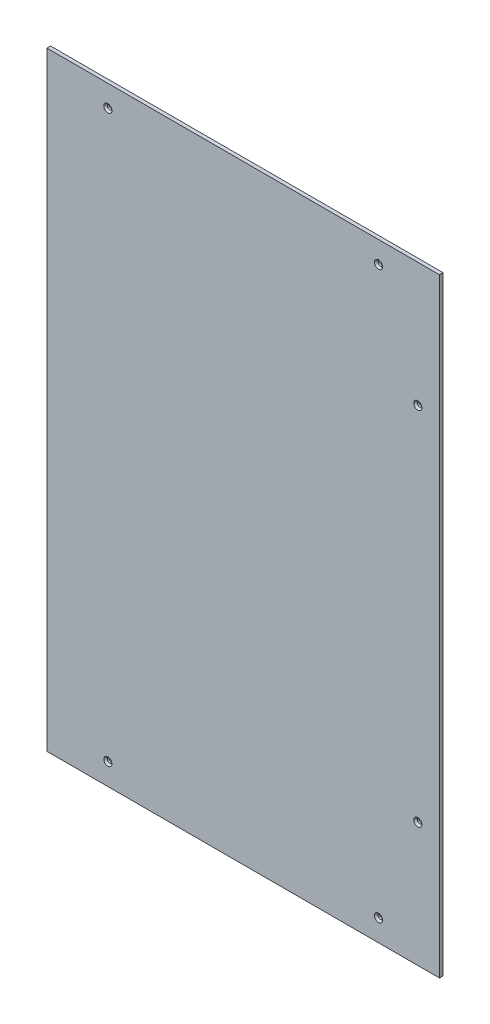
ISO-10303-21;
HEADER;
FILE_DESCRIPTION(('STEP AP214'),'2;1');
FILE_NAME('part.step','',(''),(''),'','','');
FILE_SCHEMA(('AUTOMOTIVE_DESIGN { 1 0 10303 214 1 1 1 1 }'));
ENDSEC;
DATA;
#1=APPLICATION_CONTEXT('core data for automotive mechanical design processes');
#2=APPLICATION_PROTOCOL_DEFINITION('international standard','automotive_design',2000,#1);
#3=PRODUCT_CONTEXT('',#1,'mechanical');
#4=PRODUCT('Part','Part','',(#3));
#5=PRODUCT_RELATED_PRODUCT_CATEGORY('part','',(#4));
#6=PRODUCT_DEFINITION_FORMATION('','',#4);
#7=PRODUCT_DEFINITION_CONTEXT('part definition',#1,'design');
#8=PRODUCT_DEFINITION('design','',#6,#7);
#9=PRODUCT_DEFINITION_SHAPE('','',#8);
#10=(LENGTH_UNIT() NAMED_UNIT(*) SI_UNIT(.MILLI.,.METRE.));
#11=(NAMED_UNIT(*) PLANE_ANGLE_UNIT() SI_UNIT($,.RADIAN.));
#12=(NAMED_UNIT(*) SI_UNIT($,.STERADIAN.) SOLID_ANGLE_UNIT());
#13=UNCERTAINTY_MEASURE_WITH_UNIT(LENGTH_MEASURE(1.E-05),#10,'distance_accuracy_value','');
#14=(GEOMETRIC_REPRESENTATION_CONTEXT(3) GLOBAL_UNCERTAINTY_ASSIGNED_CONTEXT((#13)) GLOBAL_UNIT_ASSIGNED_CONTEXT((#10,
#11,#12)) REPRESENTATION_CONTEXT('',''));
#15=CARTESIAN_POINT('',(0.,0.,0.));
#16=DIRECTION('',(0.,0.,1.));
#17=DIRECTION('',(1.,0.,0.));
#18=AXIS2_PLACEMENT_3D('',#15,#16,#17);
#19=CARTESIAN_POINT('',(217.5,-337.5,2.));
#20=DIRECTION('',(-1.,0.,0.));
#21=DIRECTION('',(0.,0.,1.));
#22=AXIS2_PLACEMENT_3D('',#19,#20,#21);
#23=PLANE('',#22);
#24=DIRECTION('',(0.,1.,0.));
#25=VECTOR('',#24,1.);
#26=CARTESIAN_POINT('',(217.5,-337.5,-2.));
#27=LINE('',#26,#25);
#28=CARTESIAN_POINT('',(217.5,-337.5,-2.));
#29=VERTEX_POINT('',#28);
#30=CARTESIAN_POINT('',(217.5,337.5,-2.));
#31=VERTEX_POINT('',#30);
#32=EDGE_CURVE('E126',#29,#31,#27,.T.);
#33=ORIENTED_EDGE('',*,*,#32,.T.);
#34=DIRECTION('',(0.,0.,-1.));
#35=VECTOR('',#34,1.);
#36=CARTESIAN_POINT('',(217.5,337.5,2.));
#37=LINE('',#36,#35);
#38=CARTESIAN_POINT('',(217.5,337.5,2.));
#39=VERTEX_POINT('',#38);
#40=EDGE_CURVE('E114',#39,#31,#37,.T.);
#41=ORIENTED_EDGE('',*,*,#40,.F.);
#42=DIRECTION('',(0.,1.,0.));
#43=VECTOR('',#42,1.);
#44=CARTESIAN_POINT('',(217.5,-337.5,2.));
#45=LINE('',#44,#43);
#46=CARTESIAN_POINT('',(217.5,-337.5,2.));
#47=VERTEX_POINT('',#46);
#48=EDGE_CURVE('E106',#47,#39,#45,.T.);
#49=ORIENTED_EDGE('',*,*,#48,.F.);
#50=DIRECTION('',(0.,0.,-1.));
#51=VECTOR('',#50,1.);
#52=CARTESIAN_POINT('',(217.5,-337.5,2.));
#53=LINE('',#52,#51);
#54=EDGE_CURVE('E122',#47,#29,#53,.T.);
#55=ORIENTED_EDGE('',*,*,#54,.T.);
#56=EDGE_LOOP('',(#33,#41,#49,#55));
#57=FACE_BOUND('',#56,.T.);
#58=ADVANCED_FACE('F51',(#57),#23,.F.);
#59=CARTESIAN_POINT('',(-217.5,337.5,2.));
#60=DIRECTION('',(0.,-1.,0.));
#61=DIRECTION('',(0.,0.,-1.));
#62=AXIS2_PLACEMENT_3D('',#59,#60,#61);
#63=PLANE('',#62);
#64=DIRECTION('',(-1.,0.,0.));
#65=VECTOR('',#64,1.);
#66=CARTESIAN_POINT('',(-217.5,337.5,-2.));
#67=LINE('',#66,#65);
#68=CARTESIAN_POINT('',(-217.5,337.5,-2.));
#69=VERTEX_POINT('',#68);
#70=EDGE_CURVE('E112',#31,#69,#67,.T.);
#71=ORIENTED_EDGE('',*,*,#70,.T.);
#72=DIRECTION('',(0.,0.,-1.));
#73=VECTOR('',#72,1.);
#74=CARTESIAN_POINT('',(-217.5,337.5,2.));
#75=LINE('',#74,#73);
#76=CARTESIAN_POINT('',(-217.5,337.5,2.));
#77=VERTEX_POINT('',#76);
#78=EDGE_CURVE('E110',#77,#69,#75,.T.);
#79=ORIENTED_EDGE('',*,*,#78,.F.);
#80=DIRECTION('',(-1.,0.,0.));
#81=VECTOR('',#80,1.);
#82=CARTESIAN_POINT('',(-217.5,337.5,2.));
#83=LINE('',#82,#81);
#84=EDGE_CURVE('E101',#39,#77,#83,.T.);
#85=ORIENTED_EDGE('',*,*,#84,.F.);
#86=ORIENTED_EDGE('',*,*,#40,.T.);
#87=EDGE_LOOP('',(#71,#79,#85,#86));
#88=FACE_BOUND('',#87,.T.);
#89=ADVANCED_FACE('F111',(#88),#63,.F.);
#90=CARTESIAN_POINT('',(-217.5,-337.5,2.));
#91=DIRECTION('',(1.,0.,0.));
#92=DIRECTION('',(0.,0.,-1.));
#93=AXIS2_PLACEMENT_3D('',#90,#91,#92);
#94=PLANE('',#93);
#95=DIRECTION('',(0.,-1.,0.));
#96=VECTOR('',#95,1.);
#97=CARTESIAN_POINT('',(-217.5,-337.5,-2.));
#98=LINE('',#97,#96);
#99=CARTESIAN_POINT('',(-217.5,-337.5,-2.));
#100=VERTEX_POINT('',#99);
#101=EDGE_CURVE('E87',#69,#100,#98,.T.);
#102=ORIENTED_EDGE('',*,*,#101,.T.);
#103=DIRECTION('',(0.,0.,-1.));
#104=VECTOR('',#103,1.);
#105=CARTESIAN_POINT('',(-217.5,-337.5,2.));
#106=LINE('',#105,#104);
#107=CARTESIAN_POINT('',(-217.5,-337.5,2.));
#108=VERTEX_POINT('',#107);
#109=EDGE_CURVE('E115',#108,#100,#106,.T.);
#110=ORIENTED_EDGE('',*,*,#109,.F.);
#111=DIRECTION('',(0.,-1.,0.));
#112=VECTOR('',#111,1.);
#113=CARTESIAN_POINT('',(-217.5,-337.5,2.));
#114=LINE('',#113,#112);
#115=EDGE_CURVE('E104',#77,#108,#114,.T.);
#116=ORIENTED_EDGE('',*,*,#115,.F.);
#117=ORIENTED_EDGE('',*,*,#78,.T.);
#118=EDGE_LOOP('',(#102,#110,#116,#117));
#119=FACE_BOUND('',#118,.T.);
#120=ADVANCED_FACE('F117',(#119),#94,.F.);
#121=CARTESIAN_POINT('',(-217.5,-337.5,2.));
#122=DIRECTION('',(0.,1.,0.));
#123=DIRECTION('',(0.,0.,1.));
#124=AXIS2_PLACEMENT_3D('',#121,#122,#123);
#125=PLANE('',#124);
#126=DIRECTION('',(1.,0.,0.));
#127=VECTOR('',#126,1.);
#128=CARTESIAN_POINT('',(-217.5,-337.5,-2.));
#129=LINE('',#128,#127);
#130=EDGE_CURVE('E93',#100,#29,#129,.T.);
#131=ORIENTED_EDGE('',*,*,#130,.T.);
#132=ORIENTED_EDGE('',*,*,#54,.F.);
#133=DIRECTION('',(1.,0.,0.));
#134=VECTOR('',#133,1.);
#135=CARTESIAN_POINT('',(-217.5,-337.5,2.));
#136=LINE('',#135,#134);
#137=EDGE_CURVE('E70',#108,#47,#136,.T.);
#138=ORIENTED_EDGE('',*,*,#137,.F.);
#139=ORIENTED_EDGE('',*,*,#109,.T.);
#140=EDGE_LOOP('',(#131,#132,#138,#139));
#141=FACE_BOUND('',#140,.T.);
#142=ADVANCED_FACE('F316',(#141),#125,.F.);
#143=CARTESIAN_POINT('',(0.,0.,2.));
#144=DIRECTION('',(0.,0.,-1.));
#145=DIRECTION('',(-1.,0.,0.));
#146=AXIS2_PLACEMENT_3D('',#143,#144,#145);
#147=PLANE('',#146);
#148=CARTESIAN_POINT('',(-150.,313.5,2.));
#149=DIRECTION('',(0.,0.,-1.));
#150=DIRECTION('',(-1.,0.,0.));
#151=AXIS2_PLACEMENT_3D('',#148,#149,#150);
#152=CIRCLE('',#151,4.49999999999984);
#153=CARTESIAN_POINT('',(-154.5,313.5,2.));
#154=VERTEX_POINT('',#153);
#155=EDGE_CURVE('E167',#154,#154,#152,.T.);
#156=ORIENTED_EDGE('',*,*,#155,.T.);
#157=EDGE_LOOP('',(#156));
#158=FACE_BOUND('',#157,.T.);
#159=CARTESIAN_POINT('',(150.,313.5,2.));
#160=DIRECTION('',(0.,0.,-1.));
#161=DIRECTION('',(-1.,0.,0.));
#162=AXIS2_PLACEMENT_3D('',#159,#160,#161);
#163=CIRCLE('',#162,4.50000000000006);
#164=CARTESIAN_POINT('',(145.5,313.5,2.));
#165=VERTEX_POINT('',#164);
#166=EDGE_CURVE('E163',#165,#165,#163,.T.);
#167=ORIENTED_EDGE('',*,*,#166,.T.);
#168=EDGE_LOOP('',(#167));
#169=FACE_BOUND('',#168,.T.);
#170=CARTESIAN_POINT('',(193.5,200.,2.));
#171=DIRECTION('',(0.,0.,-1.));
#172=DIRECTION('',(-1.,0.,0.));
#173=AXIS2_PLACEMENT_3D('',#170,#171,#172);
#174=CIRCLE('',#173,4.50000000000006);
#175=CARTESIAN_POINT('',(189.,200.,2.));
#176=VERTEX_POINT('',#175);
#177=EDGE_CURVE('E159',#176,#176,#174,.T.);
#178=ORIENTED_EDGE('',*,*,#177,.T.);
#179=EDGE_LOOP('',(#178));
#180=FACE_BOUND('',#179,.T.);
#181=CARTESIAN_POINT('',(193.5,-200.,2.));
#182=DIRECTION('',(0.,0.,-1.));
#183=DIRECTION('',(-1.,0.,0.));
#184=AXIS2_PLACEMENT_3D('',#181,#182,#183);
#185=CIRCLE('',#184,4.50000000000006);
#186=CARTESIAN_POINT('',(189.,-200.,2.));
#187=VERTEX_POINT('',#186);
#188=EDGE_CURVE('E155',#187,#187,#185,.T.);
#189=ORIENTED_EDGE('',*,*,#188,.T.);
#190=EDGE_LOOP('',(#189));
#191=FACE_BOUND('',#190,.T.);
#192=CARTESIAN_POINT('',(150.,-313.5,2.));
#193=DIRECTION('',(0.,0.,-1.));
#194=DIRECTION('',(-1.,0.,0.));
#195=AXIS2_PLACEMENT_3D('',#192,#193,#194);
#196=CIRCLE('',#195,4.50000000000006);
#197=CARTESIAN_POINT('',(145.5,-313.5,2.));
#198=VERTEX_POINT('',#197);
#199=EDGE_CURVE('E151',#198,#198,#196,.T.);
#200=ORIENTED_EDGE('',*,*,#199,.T.);
#201=EDGE_LOOP('',(#200));
#202=FACE_BOUND('',#201,.T.);
#203=CARTESIAN_POINT('',(-150.,-313.5,2.));
#204=DIRECTION('',(0.,0.,-1.));
#205=DIRECTION('',(-1.,0.,0.));
#206=AXIS2_PLACEMENT_3D('',#203,#204,#205);
#207=CIRCLE('',#206,4.49999999999984);
#208=CARTESIAN_POINT('',(-154.5,-313.5,2.));
#209=VERTEX_POINT('',#208);
#210=EDGE_CURVE('E147',#209,#209,#207,.T.);
#211=ORIENTED_EDGE('',*,*,#210,.T.);
#212=EDGE_LOOP('',(#211));
#213=FACE_BOUND('',#212,.T.);
#214=ORIENTED_EDGE('',*,*,#48,.T.);
#215=ORIENTED_EDGE('',*,*,#84,.T.);
#216=ORIENTED_EDGE('',*,*,#115,.T.);
#217=ORIENTED_EDGE('',*,*,#137,.T.);
#218=EDGE_LOOP('',(#214,#215,#216,#217));
#219=FACE_BOUND('',#218,.T.);
#220=ADVANCED_FACE('F102',(#158,#169,#180,#191,#202,#213,#219),#147,.F.);
#221=CARTESIAN_POINT('',(0.,0.,-2.));
#222=DIRECTION('',(0.,0.,-1.));
#223=DIRECTION('',(-1.,0.,0.));
#224=AXIS2_PLACEMENT_3D('',#221,#222,#223);
#225=PLANE('',#224);
#226=CARTESIAN_POINT('',(-150.,313.5,-2.));
#227=DIRECTION('',(0.,0.,1.));
#228=DIRECTION('',(1.,0.,0.));
#229=AXIS2_PLACEMENT_3D('',#226,#227,#228);
#230=CIRCLE('',#229,2.5);
#231=CARTESIAN_POINT('',(-147.5,313.5,-2.));
#232=VERTEX_POINT('',#231);
#233=EDGE_CURVE('E270',#232,#232,#230,.T.);
#234=ORIENTED_EDGE('',*,*,#233,.T.);
#235=EDGE_LOOP('',(#234));
#236=FACE_BOUND('',#235,.T.);
#237=CARTESIAN_POINT('',(150.,313.5,-2.));
#238=DIRECTION('',(0.,0.,1.));
#239=DIRECTION('',(1.,0.,0.));
#240=AXIS2_PLACEMENT_3D('',#237,#238,#239);
#241=CIRCLE('',#240,2.5);
#242=CARTESIAN_POINT('',(152.5,313.5,-2.));
#243=VERTEX_POINT('',#242);
#244=EDGE_CURVE('E261',#243,#243,#241,.T.);
#245=ORIENTED_EDGE('',*,*,#244,.T.);
#246=EDGE_LOOP('',(#245));
#247=FACE_BOUND('',#246,.T.);
#248=CARTESIAN_POINT('',(193.5,200.,-2.));
#249=DIRECTION('',(0.,0.,1.));
#250=DIRECTION('',(1.,0.,0.));
#251=AXIS2_PLACEMENT_3D('',#248,#249,#250);
#252=CIRCLE('',#251,2.5);
#253=CARTESIAN_POINT('',(196.,200.,-2.));
#254=VERTEX_POINT('',#253);
#255=EDGE_CURVE('E257',#254,#254,#252,.T.);
#256=ORIENTED_EDGE('',*,*,#255,.T.);
#257=EDGE_LOOP('',(#256));
#258=FACE_BOUND('',#257,.T.);
#259=CARTESIAN_POINT('',(193.5,-200.,-2.));
#260=DIRECTION('',(0.,0.,1.));
#261=DIRECTION('',(1.,0.,0.));
#262=AXIS2_PLACEMENT_3D('',#259,#260,#261);
#263=CIRCLE('',#262,2.5);
#264=CARTESIAN_POINT('',(196.,-200.,-2.));
#265=VERTEX_POINT('',#264);
#266=EDGE_CURVE('E260',#265,#265,#263,.T.);
#267=ORIENTED_EDGE('',*,*,#266,.T.);
#268=EDGE_LOOP('',(#267));
#269=FACE_BOUND('',#268,.T.);
#270=CARTESIAN_POINT('',(150.,-313.5,-2.));
#271=DIRECTION('',(0.,0.,1.));
#272=DIRECTION('',(1.,0.,0.));
#273=AXIS2_PLACEMENT_3D('',#270,#271,#272);
#274=CIRCLE('',#273,2.5);
#275=CARTESIAN_POINT('',(152.5,-313.5,-2.));
#276=VERTEX_POINT('',#275);
#277=EDGE_CURVE('E267',#276,#276,#274,.T.);
#278=ORIENTED_EDGE('',*,*,#277,.T.);
#279=EDGE_LOOP('',(#278));
#280=FACE_BOUND('',#279,.T.);
#281=CARTESIAN_POINT('',(-150.,-313.5,-2.));
#282=DIRECTION('',(0.,0.,1.));
#283=DIRECTION('',(1.,0.,0.));
#284=AXIS2_PLACEMENT_3D('',#281,#282,#283);
#285=CIRCLE('',#284,2.5);
#286=CARTESIAN_POINT('',(-147.5,-313.5,-2.));
#287=VERTEX_POINT('',#286);
#288=EDGE_CURVE('E130',#287,#287,#285,.T.);
#289=ORIENTED_EDGE('',*,*,#288,.T.);
#290=EDGE_LOOP('',(#289));
#291=FACE_BOUND('',#290,.T.);
#292=ORIENTED_EDGE('',*,*,#32,.F.);
#293=ORIENTED_EDGE('',*,*,#130,.F.);
#294=ORIENTED_EDGE('',*,*,#101,.F.);
#295=ORIENTED_EDGE('',*,*,#70,.F.);
#296=EDGE_LOOP('',(#292,#293,#294,#295));
#297=FACE_BOUND('',#296,.T.);
#298=ADVANCED_FACE('F293',(#236,#247,#258,#269,#280,#291,#297),#225,.T.);
#299=CARTESIAN_POINT('',(-150.,-313.5,-2.));
#300=DIRECTION('',(0.,0.,1.));
#301=DIRECTION('',(1.,0.,0.));
#302=AXIS2_PLACEMENT_3D('',#299,#300,#301);
#303=CYLINDRICAL_SURFACE('',#302,2.5);
#304=CARTESIAN_POINT('',(-150.,-313.5,1.49619899803E-13));
#305=DIRECTION('',(0.,0.,-1.));
#306=DIRECTION('',(-1.,0.,0.));
#307=AXIS2_PLACEMENT_3D('',#304,#305,#306);
#308=CIRCLE('',#307,2.5);
#309=CARTESIAN_POINT('',(-152.5,-313.5,1.49619899803E-13));
#310=VERTEX_POINT('',#309);
#311=EDGE_CURVE('E11',#310,#310,#308,.F.);
#312=ORIENTED_EDGE('',*,*,#311,.T.);
#313=EDGE_LOOP('',(#312));
#314=FACE_BOUND('',#313,.T.);
#315=ORIENTED_EDGE('',*,*,#288,.F.);
#316=EDGE_LOOP('',(#315));
#317=FACE_BOUND('',#316,.T.);
#318=ADVANCED_FACE('F296',(#314,#317),#303,.F.);
#319=CARTESIAN_POINT('',(150.,-313.5,-2.));
#320=DIRECTION('',(0.,0.,1.));
#321=DIRECTION('',(1.,0.,0.));
#322=AXIS2_PLACEMENT_3D('',#319,#320,#321);
#323=CYLINDRICAL_SURFACE('',#322,2.5);
#324=CARTESIAN_POINT('',(150.,-313.5,0.));
#325=DIRECTION('',(0.,0.,-1.));
#326=DIRECTION('',(-1.,0.,0.));
#327=AXIS2_PLACEMENT_3D('',#324,#325,#326);
#328=CIRCLE('',#327,2.5);
#329=CARTESIAN_POINT('',(147.5,-313.5,0.));
#330=VERTEX_POINT('',#329);
#331=EDGE_CURVE('E62',#330,#330,#328,.F.);
#332=ORIENTED_EDGE('',*,*,#331,.T.);
#333=EDGE_LOOP('',(#332));
#334=FACE_BOUND('',#333,.T.);
#335=ORIENTED_EDGE('',*,*,#277,.F.);
#336=EDGE_LOOP('',(#335));
#337=FACE_BOUND('',#336,.T.);
#338=ADVANCED_FACE('F187',(#334,#337),#323,.F.);
#339=CARTESIAN_POINT('',(193.5,-200.,-2.));
#340=DIRECTION('',(0.,0.,1.));
#341=DIRECTION('',(1.,0.,0.));
#342=AXIS2_PLACEMENT_3D('',#339,#340,#341);
#343=CYLINDRICAL_SURFACE('',#342,2.5);
#344=CARTESIAN_POINT('',(193.5,-200.,0.));
#345=DIRECTION('',(0.,0.,-1.));
#346=DIRECTION('',(-1.,0.,0.));
#347=AXIS2_PLACEMENT_3D('',#344,#345,#346);
#348=CIRCLE('',#347,2.5);
#349=CARTESIAN_POINT('',(191.,-200.,0.));
#350=VERTEX_POINT('',#349);
#351=EDGE_CURVE('E179',#350,#350,#348,.F.);
#352=ORIENTED_EDGE('',*,*,#351,.T.);
#353=EDGE_LOOP('',(#352));
#354=FACE_BOUND('',#353,.T.);
#355=ORIENTED_EDGE('',*,*,#266,.F.);
#356=EDGE_LOOP('',(#355));
#357=FACE_BOUND('',#356,.T.);
#358=ADVANCED_FACE('F253',(#354,#357),#343,.F.);
#359=CARTESIAN_POINT('',(193.5,200.,-2.));
#360=DIRECTION('',(0.,0.,1.));
#361=DIRECTION('',(1.,0.,0.));
#362=AXIS2_PLACEMENT_3D('',#359,#360,#361);
#363=CYLINDRICAL_SURFACE('',#362,2.5);
#364=CARTESIAN_POINT('',(193.5,200.,0.));
#365=DIRECTION('',(0.,0.,-1.));
#366=DIRECTION('',(-1.,0.,0.));
#367=AXIS2_PLACEMENT_3D('',#364,#365,#366);
#368=CIRCLE('',#367,2.5);
#369=CARTESIAN_POINT('',(191.,200.,0.));
#370=VERTEX_POINT('',#369);
#371=EDGE_CURVE('E175',#370,#370,#368,.F.);
#372=ORIENTED_EDGE('',*,*,#371,.T.);
#373=EDGE_LOOP('',(#372));
#374=FACE_BOUND('',#373,.T.);
#375=ORIENTED_EDGE('',*,*,#255,.F.);
#376=EDGE_LOOP('',(#375));
#377=FACE_BOUND('',#376,.T.);
#378=ADVANCED_FACE('F249',(#374,#377),#363,.F.);
#379=CARTESIAN_POINT('',(150.,313.5,-2.));
#380=DIRECTION('',(0.,0.,1.));
#381=DIRECTION('',(1.,0.,0.));
#382=AXIS2_PLACEMENT_3D('',#379,#380,#381);
#383=CYLINDRICAL_SURFACE('',#382,2.5);
#384=CARTESIAN_POINT('',(150.,313.5,0.));
#385=DIRECTION('',(0.,0.,-1.));
#386=DIRECTION('',(-1.,0.,0.));
#387=AXIS2_PLACEMENT_3D('',#384,#385,#386);
#388=CIRCLE('',#387,2.5);
#389=CARTESIAN_POINT('',(147.5,313.5,0.));
#390=VERTEX_POINT('',#389);
#391=EDGE_CURVE('E171',#390,#390,#388,.F.);
#392=ORIENTED_EDGE('',*,*,#391,.T.);
#393=EDGE_LOOP('',(#392));
#394=FACE_BOUND('',#393,.T.);
#395=ORIENTED_EDGE('',*,*,#244,.F.);
#396=EDGE_LOOP('',(#395));
#397=FACE_BOUND('',#396,.T.);
#398=ADVANCED_FACE('F252',(#394,#397),#383,.F.);
#399=CARTESIAN_POINT('',(-150.,313.5,-2.));
#400=DIRECTION('',(0.,0.,1.));
#401=DIRECTION('',(1.,0.,0.));
#402=AXIS2_PLACEMENT_3D('',#399,#400,#401);
#403=CYLINDRICAL_SURFACE('',#402,2.5);
#404=CARTESIAN_POINT('',(-150.,313.5,1.49619899803E-13));
#405=DIRECTION('',(0.,0.,-1.));
#406=DIRECTION('',(-1.,0.,0.));
#407=AXIS2_PLACEMENT_3D('',#404,#405,#406);
#408=CIRCLE('',#407,2.5);
#409=CARTESIAN_POINT('',(-152.5,313.5,1.49619899803E-13));
#410=VERTEX_POINT('',#409);
#411=EDGE_CURVE('E143',#410,#410,#408,.F.);
#412=ORIENTED_EDGE('',*,*,#411,.T.);
#413=EDGE_LOOP('',(#412));
#414=FACE_BOUND('',#413,.T.);
#415=ORIENTED_EDGE('',*,*,#233,.F.);
#416=EDGE_LOOP('',(#415));
#417=FACE_BOUND('',#416,.T.);
#418=ADVANCED_FACE('F223',(#414,#417),#403,.F.);
#419=CARTESIAN_POINT('',(-150.,313.5,1.49619899803E-13));
#420=DIRECTION('',(0.,0.,1.));
#421=DIRECTION('',(1.,0.,0.));
#422=AXIS2_PLACEMENT_3D('',#419,#420,#421);
#423=CONICAL_SURFACE('',#422,2.5,0.785398163397446);
#424=ORIENTED_EDGE('',*,*,#155,.F.);
#425=EDGE_LOOP('',(#424));
#426=FACE_BOUND('',#425,.T.);
#427=ORIENTED_EDGE('',*,*,#411,.F.);
#428=EDGE_LOOP('',(#427));
#429=FACE_BOUND('',#428,.T.);
#430=ADVANCED_FACE('F216',(#426,#429),#423,.F.);
#431=CARTESIAN_POINT('',(150.,313.5,0.));
#432=DIRECTION('',(0.,0.,1.));
#433=DIRECTION('',(1.,0.,0.));
#434=AXIS2_PLACEMENT_3D('',#431,#432,#433);
#435=CONICAL_SURFACE('',#434,2.5,0.785398163397446);
#436=ORIENTED_EDGE('',*,*,#166,.F.);
#437=EDGE_LOOP('',(#436));
#438=FACE_BOUND('',#437,.T.);
#439=ORIENTED_EDGE('',*,*,#391,.F.);
#440=EDGE_LOOP('',(#439));
#441=FACE_BOUND('',#440,.T.);
#442=ADVANCED_FACE('F222',(#438,#441),#435,.F.);
#443=CARTESIAN_POINT('',(193.5,200.,0.));
#444=DIRECTION('',(0.,0.,1.));
#445=DIRECTION('',(1.,0.,0.));
#446=AXIS2_PLACEMENT_3D('',#443,#444,#445);
#447=CONICAL_SURFACE('',#446,2.5,0.785398163397446);
#448=ORIENTED_EDGE('',*,*,#177,.F.);
#449=EDGE_LOOP('',(#448));
#450=FACE_BOUND('',#449,.T.);
#451=ORIENTED_EDGE('',*,*,#371,.F.);
#452=EDGE_LOOP('',(#451));
#453=FACE_BOUND('',#452,.T.);
#454=ADVANCED_FACE('F200',(#450,#453),#447,.F.);
#455=CARTESIAN_POINT('',(193.5,-200.,0.));
#456=DIRECTION('',(0.,0.,1.));
#457=DIRECTION('',(1.,0.,0.));
#458=AXIS2_PLACEMENT_3D('',#455,#456,#457);
#459=CONICAL_SURFACE('',#458,2.5,0.785398163397446);
#460=ORIENTED_EDGE('',*,*,#188,.F.);
#461=EDGE_LOOP('',(#460));
#462=FACE_BOUND('',#461,.T.);
#463=ORIENTED_EDGE('',*,*,#351,.F.);
#464=EDGE_LOOP('',(#463));
#465=FACE_BOUND('',#464,.T.);
#466=ADVANCED_FACE('F192',(#462,#465),#459,.F.);
#467=CARTESIAN_POINT('',(150.,-313.5,0.));
#468=DIRECTION('',(0.,0.,1.));
#469=DIRECTION('',(1.,0.,0.));
#470=AXIS2_PLACEMENT_3D('',#467,#468,#469);
#471=CONICAL_SURFACE('',#470,2.5,0.785398163397446);
#472=ORIENTED_EDGE('',*,*,#199,.F.);
#473=EDGE_LOOP('',(#472));
#474=FACE_BOUND('',#473,.T.);
#475=ORIENTED_EDGE('',*,*,#331,.F.);
#476=EDGE_LOOP('',(#475));
#477=FACE_BOUND('',#476,.T.);
#478=ADVANCED_FACE('F190',(#474,#477),#471,.F.);
#479=CARTESIAN_POINT('',(-150.,-313.5,1.49619899803E-13));
#480=DIRECTION('',(0.,0.,1.));
#481=DIRECTION('',(1.,0.,0.));
#482=AXIS2_PLACEMENT_3D('',#479,#480,#481);
#483=CONICAL_SURFACE('',#482,2.5,0.785398163397446);
#484=ORIENTED_EDGE('',*,*,#210,.F.);
#485=EDGE_LOOP('',(#484));
#486=FACE_BOUND('',#485,.T.);
#487=ORIENTED_EDGE('',*,*,#311,.F.);
#488=EDGE_LOOP('',(#487));
#489=FACE_BOUND('',#488,.T.);
#490=ADVANCED_FACE('F54',(#486,#489),#483,.F.);
#491=CLOSED_SHELL('',(#58,#89,#120,#142,#220,#298,#318,#338,#358,#378,#398,#418,#430,#442,#454,
#466,#478,#490));
#492=MANIFOLD_SOLID_BREP('B2',#491);
#493=ADVANCED_BREP_SHAPE_REPRESENTATION('',(#18,#492),#14);
#494=SHAPE_DEFINITION_REPRESENTATION(#9,#493);
ENDSEC;
END-ISO-10303-21;
